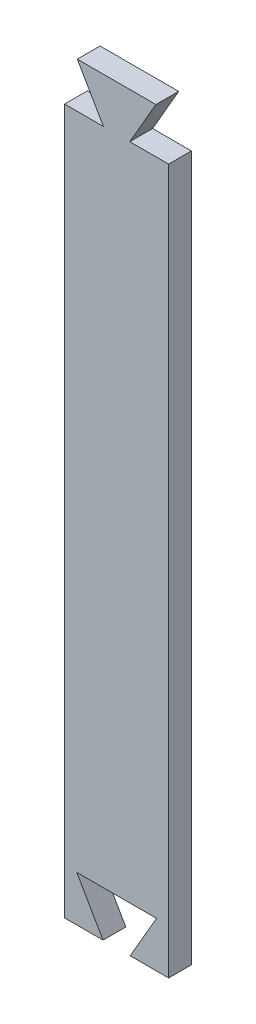
ISO-10303-21;
HEADER;
FILE_DESCRIPTION(('STEP AP214'),'2;1');
FILE_NAME('part.step','',(''),(''),'','','');
FILE_SCHEMA(('AUTOMOTIVE_DESIGN { 1 0 10303 214 1 1 1 1 }'));
ENDSEC;
DATA;
#1=APPLICATION_CONTEXT('core data for automotive mechanical design processes');
#2=APPLICATION_PROTOCOL_DEFINITION('international standard','automotive_design',2000,#1);
#3=PRODUCT_CONTEXT('',#1,'mechanical');
#4=PRODUCT('Part','Part','',(#3));
#5=PRODUCT_RELATED_PRODUCT_CATEGORY('part','',(#4));
#6=PRODUCT_DEFINITION_FORMATION('','',#4);
#7=PRODUCT_DEFINITION_CONTEXT('part definition',#1,'design');
#8=PRODUCT_DEFINITION('design','',#6,#7);
#9=PRODUCT_DEFINITION_SHAPE('','',#8);
#10=(LENGTH_UNIT() NAMED_UNIT(*) SI_UNIT(.MILLI.,.METRE.));
#11=(NAMED_UNIT(*) PLANE_ANGLE_UNIT() SI_UNIT($,.RADIAN.));
#12=(NAMED_UNIT(*) SI_UNIT($,.STERADIAN.) SOLID_ANGLE_UNIT());
#13=UNCERTAINTY_MEASURE_WITH_UNIT(LENGTH_MEASURE(1.E-05),#10,'distance_accuracy_value','');
#14=(GEOMETRIC_REPRESENTATION_CONTEXT(3) GLOBAL_UNCERTAINTY_ASSIGNED_CONTEXT((#13)) GLOBAL_UNIT_ASSIGNED_CONTEXT((#10,
#11,#12)) REPRESENTATION_CONTEXT('',''));
#15=CARTESIAN_POINT('',(0.,0.,0.));
#16=DIRECTION('',(0.,0.,1.));
#17=DIRECTION('',(1.,0.,0.));
#18=AXIS2_PLACEMENT_3D('',#15,#16,#17);
#19=CARTESIAN_POINT('',(-3.02412126503343,0.,5.08));
#20=DIRECTION('',(0.,1.,0.));
#21=DIRECTION('',(0.,0.,1.));
#22=AXIS2_PLACEMENT_3D('',#19,#20,#21);
#23=PLANE('',#22);
#24=DIRECTION('',(1.,0.,0.));
#25=VECTOR('',#24,1.);
#26=CARTESIAN_POINT('',(-3.02412126503343,0.,0.));
#27=LINE('',#26,#25);
#28=CARTESIAN_POINT('',(-11.5976146,0.,0.));
#29=VERTEX_POINT('',#28);
#30=CARTESIAN_POINT('',(-3.02412126503343,0.,0.));
#31=VERTEX_POINT('',#30);
#32=EDGE_CURVE('E164',#29,#31,#27,.T.);
#33=ORIENTED_EDGE('',*,*,#32,.T.);
#34=DIRECTION('',(0.,0.,-1.));
#35=VECTOR('',#34,1.);
#36=CARTESIAN_POINT('',(-3.02412126503343,0.,5.08));
#37=LINE('',#36,#35);
#38=CARTESIAN_POINT('',(-3.02412126503343,0.,5.08));
#39=VERTEX_POINT('',#38);
#40=EDGE_CURVE('E11',#39,#31,#37,.T.);
#41=ORIENTED_EDGE('',*,*,#40,.F.);
#42=DIRECTION('',(1.,0.,0.));
#43=VECTOR('',#42,1.);
#44=CARTESIAN_POINT('',(-3.02412126503343,0.,5.08));
#45=LINE('',#44,#43);
#46=CARTESIAN_POINT('',(-11.5976146,0.,5.08));
#47=VERTEX_POINT('',#46);
#48=EDGE_CURVE('E198',#47,#39,#45,.T.);
#49=ORIENTED_EDGE('',*,*,#48,.F.);
#50=DIRECTION('',(0.,0.,-1.));
#51=VECTOR('',#50,1.);
#52=CARTESIAN_POINT('',(-11.5976146,0.,5.08));
#53=LINE('',#52,#51);
#54=EDGE_CURVE('E160',#47,#29,#53,.T.);
#55=ORIENTED_EDGE('',*,*,#54,.T.);
#56=EDGE_LOOP('',(#33,#41,#49,#55));
#57=FACE_BOUND('',#56,.T.);
#58=ADVANCED_FACE('F39',(#57),#23,.F.);
#59=CARTESIAN_POINT('',(-3.02412126503343,0.,5.08));
#60=DIRECTION('',(-0.86602540378444,-0.499999999999998,0.));
#61=DIRECTION('',(0.499999999999998,-0.86602540378444,0.));
#62=AXIS2_PLACEMENT_3D('',#59,#60,#61);
#63=PLANE('',#62);
#64=DIRECTION('',(-0.499999999999998,0.86602540378444,0.));
#65=VECTOR('',#64,1.);
#66=CARTESIAN_POINT('',(-3.02412126503343,0.,0.));
#67=LINE('',#66,#65);
#68=CARTESIAN_POINT('',(-8.89,10.16,0.));
#69=VERTEX_POINT('',#68);
#70=EDGE_CURVE('E168',#31,#69,#67,.T.);
#71=ORIENTED_EDGE('',*,*,#70,.T.);
#72=DIRECTION('',(0.,0.,-1.));
#73=VECTOR('',#72,1.);
#74=CARTESIAN_POINT('',(-8.89,10.16,5.08));
#75=LINE('',#74,#73);
#76=CARTESIAN_POINT('',(-8.89,10.16,5.08));
#77=VERTEX_POINT('',#76);
#78=EDGE_CURVE('E48',#77,#69,#75,.T.);
#79=ORIENTED_EDGE('',*,*,#78,.F.);
#80=DIRECTION('',(-0.499999999999998,0.86602540378444,0.));
#81=VECTOR('',#80,1.);
#82=CARTESIAN_POINT('',(-3.02412126503343,0.,5.08));
#83=LINE('',#82,#81);
#84=EDGE_CURVE('E111',#39,#77,#83,.T.);
#85=ORIENTED_EDGE('',*,*,#84,.F.);
#86=ORIENTED_EDGE('',*,*,#40,.T.);
#87=EDGE_LOOP('',(#71,#79,#85,#86));
#88=FACE_BOUND('',#87,.T.);
#89=ADVANCED_FACE('F292',(#88),#63,.F.);
#90=CARTESIAN_POINT('',(-8.89,10.16,5.08));
#91=DIRECTION('',(0.,1.,0.));
#92=DIRECTION('',(0.,0.,1.));
#93=AXIS2_PLACEMENT_3D('',#90,#91,#92);
#94=PLANE('',#93);
#95=DIRECTION('',(1.,0.,0.));
#96=VECTOR('',#95,1.);
#97=CARTESIAN_POINT('',(-8.89,10.16,0.));
#98=LINE('',#97,#96);
#99=CARTESIAN_POINT('',(8.89,10.16,0.));
#100=VERTEX_POINT('',#99);
#101=EDGE_CURVE('E171',#69,#100,#98,.T.);
#102=ORIENTED_EDGE('',*,*,#101,.T.);
#103=DIRECTION('',(0.,0.,-1.));
#104=VECTOR('',#103,1.);
#105=CARTESIAN_POINT('',(8.89,10.16,5.08));
#106=LINE('',#105,#104);
#107=CARTESIAN_POINT('',(8.89,10.16,5.08));
#108=VERTEX_POINT('',#107);
#109=EDGE_CURVE('E225',#108,#100,#106,.T.);
#110=ORIENTED_EDGE('',*,*,#109,.F.);
#111=DIRECTION('',(1.,0.,0.));
#112=VECTOR('',#111,1.);
#113=CARTESIAN_POINT('',(-8.89,10.16,5.08));
#114=LINE('',#113,#112);
#115=EDGE_CURVE('E235',#77,#108,#114,.T.);
#116=ORIENTED_EDGE('',*,*,#115,.F.);
#117=ORIENTED_EDGE('',*,*,#78,.T.);
#118=EDGE_LOOP('',(#102,#110,#116,#117));
#119=FACE_BOUND('',#118,.T.);
#120=ADVANCED_FACE('F233',(#119),#94,.F.);
#121=CARTESIAN_POINT('',(8.89,10.16,5.08));
#122=DIRECTION('',(0.866025403784436,-0.500000000000004,0.));
#123=DIRECTION('',(0.500000000000004,0.866025403784436,0.));
#124=AXIS2_PLACEMENT_3D('',#121,#122,#123);
#125=PLANE('',#124);
#126=DIRECTION('',(-0.500000000000004,-0.866025403784436,0.));
#127=VECTOR('',#126,1.);
#128=CARTESIAN_POINT('',(8.89,10.16,0.));
#129=LINE('',#128,#127);
#130=CARTESIAN_POINT('',(3.02412126503334,0.,0.));
#131=VERTEX_POINT('',#130);
#132=EDGE_CURVE('E174',#100,#131,#129,.T.);
#133=ORIENTED_EDGE('',*,*,#132,.T.);
#134=DIRECTION('',(0.,0.,-1.));
#135=VECTOR('',#134,1.);
#136=CARTESIAN_POINT('',(3.02412126503334,0.,5.08));
#137=LINE('',#136,#135);
#138=CARTESIAN_POINT('',(3.02412126503334,0.,5.08));
#139=VERTEX_POINT('',#138);
#140=EDGE_CURVE('E221',#139,#131,#137,.T.);
#141=ORIENTED_EDGE('',*,*,#140,.F.);
#142=DIRECTION('',(-0.500000000000004,-0.866025403784436,0.));
#143=VECTOR('',#142,1.);
#144=CARTESIAN_POINT('',(8.89,10.16,5.08));
#145=LINE('',#144,#143);
#146=EDGE_CURVE('E254',#108,#139,#145,.T.);
#147=ORIENTED_EDGE('',*,*,#146,.F.);
#148=ORIENTED_EDGE('',*,*,#109,.T.);
#149=EDGE_LOOP('',(#133,#141,#147,#148));
#150=FACE_BOUND('',#149,.T.);
#151=ADVANCED_FACE('F244',(#150),#125,.F.);
#152=CARTESIAN_POINT('',(3.02412126503334,0.,5.08));
#153=DIRECTION('',(0.,1.,0.));
#154=DIRECTION('',(0.,0.,1.));
#155=AXIS2_PLACEMENT_3D('',#152,#153,#154);
#156=PLANE('',#155);
#157=DIRECTION('',(1.,0.,0.));
#158=VECTOR('',#157,1.);
#159=CARTESIAN_POINT('',(3.02412126503334,0.,0.));
#160=LINE('',#159,#158);
#161=CARTESIAN_POINT('',(11.5976146,0.,0.));
#162=VERTEX_POINT('',#161);
#163=EDGE_CURVE('E177',#131,#162,#160,.T.);
#164=ORIENTED_EDGE('',*,*,#163,.T.);
#165=DIRECTION('',(0.,0.,-1.));
#166=VECTOR('',#165,1.);
#167=CARTESIAN_POINT('',(11.5976146,0.,5.08));
#168=LINE('',#167,#166);
#169=CARTESIAN_POINT('',(11.5976146,0.,5.08));
#170=VERTEX_POINT('',#169);
#171=EDGE_CURVE('E217',#170,#162,#168,.T.);
#172=ORIENTED_EDGE('',*,*,#171,.F.);
#173=DIRECTION('',(1.,0.,0.));
#174=VECTOR('',#173,1.);
#175=CARTESIAN_POINT('',(3.02412126503334,0.,5.08));
#176=LINE('',#175,#174);
#177=EDGE_CURVE('E250',#139,#170,#176,.T.);
#178=ORIENTED_EDGE('',*,*,#177,.F.);
#179=ORIENTED_EDGE('',*,*,#140,.T.);
#180=EDGE_LOOP('',(#164,#172,#178,#179));
#181=FACE_BOUND('',#180,.T.);
#182=ADVANCED_FACE('F248',(#181),#156,.F.);
#183=CARTESIAN_POINT('',(11.5976146,0.,5.08));
#184=DIRECTION('',(-1.,0.,0.));
#185=DIRECTION('',(0.,-1.,0.));
#186=AXIS2_PLACEMENT_3D('',#183,#184,#185);
#187=PLANE('',#186);
#188=DIRECTION('',(0.,1.,0.));
#189=VECTOR('',#188,1.);
#190=CARTESIAN_POINT('',(11.5976146,0.,0.));
#191=LINE('',#190,#189);
#192=CARTESIAN_POINT('',(11.5976146,157.1625,0.));
#193=VERTEX_POINT('',#192);
#194=EDGE_CURVE('E180',#162,#193,#191,.T.);
#195=ORIENTED_EDGE('',*,*,#194,.T.);
#196=DIRECTION('',(0.,0.,-1.));
#197=VECTOR('',#196,1.);
#198=CARTESIAN_POINT('',(11.5976146,157.1625,5.08));
#199=LINE('',#198,#197);
#200=CARTESIAN_POINT('',(11.5976146,157.1625,5.08));
#201=VERTEX_POINT('',#200);
#202=EDGE_CURVE('E213',#201,#193,#199,.T.);
#203=ORIENTED_EDGE('',*,*,#202,.F.);
#204=DIRECTION('',(0.,1.,0.));
#205=VECTOR('',#204,1.);
#206=CARTESIAN_POINT('',(11.5976146,0.,5.08));
#207=LINE('',#206,#205);
#208=EDGE_CURVE('E253',#170,#201,#207,.T.);
#209=ORIENTED_EDGE('',*,*,#208,.F.);
#210=ORIENTED_EDGE('',*,*,#171,.T.);
#211=EDGE_LOOP('',(#195,#203,#209,#210));
#212=FACE_BOUND('',#211,.T.);
#213=ADVANCED_FACE('F305',(#212),#187,.F.);
#214=CARTESIAN_POINT('',(11.5976146,157.1625,5.08));
#215=DIRECTION('',(0.,-1.,0.));
#216=DIRECTION('',(0.,0.,-1.));
#217=AXIS2_PLACEMENT_3D('',#214,#215,#216);
#218=PLANE('',#217);
#219=DIRECTION('',(-1.,0.,0.));
#220=VECTOR('',#219,1.);
#221=CARTESIAN_POINT('',(11.5976146,157.1625,0.));
#222=LINE('',#221,#220);
#223=CARTESIAN_POINT('',(2.94111535554568,157.1625,0.));
#224=VERTEX_POINT('',#223);
#225=EDGE_CURVE('E183',#193,#224,#222,.T.);
#226=ORIENTED_EDGE('',*,*,#225,.T.);
#227=DIRECTION('',(0.,0.,-1.));
#228=VECTOR('',#227,1.);
#229=CARTESIAN_POINT('',(2.94111535554568,157.1625,5.08));
#230=LINE('',#229,#228);
#231=CARTESIAN_POINT('',(2.94111535554568,157.1625,5.08));
#232=VERTEX_POINT('',#231);
#233=EDGE_CURVE('E209',#232,#224,#230,.T.);
#234=ORIENTED_EDGE('',*,*,#233,.F.);
#235=DIRECTION('',(-1.,0.,0.));
#236=VECTOR('',#235,1.);
#237=CARTESIAN_POINT('',(11.5976146,157.1625,5.08));
#238=LINE('',#237,#236);
#239=EDGE_CURVE('E258',#201,#232,#238,.T.);
#240=ORIENTED_EDGE('',*,*,#239,.F.);
#241=ORIENTED_EDGE('',*,*,#202,.T.);
#242=EDGE_LOOP('',(#226,#234,#240,#241));
#243=FACE_BOUND('',#242,.T.);
#244=ADVANCED_FACE('F308',(#243),#218,.F.);
#245=CARTESIAN_POINT('',(8.763,167.2463,5.08));
#246=DIRECTION('',(-0.86602540378444,0.499999999999998,0.));
#247=DIRECTION('',(-0.499999999999998,-0.86602540378444,0.));
#248=AXIS2_PLACEMENT_3D('',#245,#246,#247);
#249=PLANE('',#248);
#250=DIRECTION('',(0.499999999999998,0.86602540378444,0.));
#251=VECTOR('',#250,1.);
#252=CARTESIAN_POINT('',(8.763,167.2463,0.));
#253=LINE('',#252,#251);
#254=CARTESIAN_POINT('',(8.763,167.2463,0.));
#255=VERTEX_POINT('',#254);
#256=EDGE_CURVE('E186',#224,#255,#253,.T.);
#257=ORIENTED_EDGE('',*,*,#256,.T.);
#258=DIRECTION('',(0.,0.,-1.));
#259=VECTOR('',#258,1.);
#260=CARTESIAN_POINT('',(8.763,167.2463,5.08));
#261=LINE('',#260,#259);
#262=CARTESIAN_POINT('',(8.763,167.2463,5.08));
#263=VERTEX_POINT('',#262);
#264=EDGE_CURVE('E205',#263,#255,#261,.T.);
#265=ORIENTED_EDGE('',*,*,#264,.F.);
#266=DIRECTION('',(0.499999999999998,0.86602540378444,0.));
#267=VECTOR('',#266,1.);
#268=CARTESIAN_POINT('',(8.763,167.2463,5.08));
#269=LINE('',#268,#267);
#270=EDGE_CURVE('E265',#232,#263,#269,.T.);
#271=ORIENTED_EDGE('',*,*,#270,.F.);
#272=ORIENTED_EDGE('',*,*,#233,.T.);
#273=EDGE_LOOP('',(#257,#265,#271,#272));
#274=FACE_BOUND('',#273,.T.);
#275=ADVANCED_FACE('F273',(#274),#249,.F.);
#276=CARTESIAN_POINT('',(-8.763,167.2463,5.08));
#277=DIRECTION('',(0.,-1.,0.));
#278=DIRECTION('',(0.,0.,-1.));
#279=AXIS2_PLACEMENT_3D('',#276,#277,#278);
#280=PLANE('',#279);
#281=DIRECTION('',(-1.,0.,0.));
#282=VECTOR('',#281,1.);
#283=CARTESIAN_POINT('',(-8.763,167.2463,0.));
#284=LINE('',#283,#282);
#285=CARTESIAN_POINT('',(-8.763,167.2463,0.));
#286=VERTEX_POINT('',#285);
#287=EDGE_CURVE('E189',#255,#286,#284,.T.);
#288=ORIENTED_EDGE('',*,*,#287,.T.);
#289=DIRECTION('',(0.,0.,-1.));
#290=VECTOR('',#289,1.);
#291=CARTESIAN_POINT('',(-8.763,167.2463,5.08));
#292=LINE('',#291,#290);
#293=CARTESIAN_POINT('',(-8.763,167.2463,5.08));
#294=VERTEX_POINT('',#293);
#295=EDGE_CURVE('E153',#294,#286,#292,.T.);
#296=ORIENTED_EDGE('',*,*,#295,.F.);
#297=DIRECTION('',(-1.,0.,0.));
#298=VECTOR('',#297,1.);
#299=CARTESIAN_POINT('',(-8.763,167.2463,5.08));
#300=LINE('',#299,#298);
#301=EDGE_CURVE('E142',#263,#294,#300,.T.);
#302=ORIENTED_EDGE('',*,*,#301,.F.);
#303=ORIENTED_EDGE('',*,*,#264,.T.);
#304=EDGE_LOOP('',(#288,#296,#302,#303));
#305=FACE_BOUND('',#304,.T.);
#306=ADVANCED_FACE('F277',(#305),#280,.F.);
#307=CARTESIAN_POINT('',(-2.94111535554568,157.1625,5.08));
#308=DIRECTION('',(0.86602540378444,0.499999999999998,0.));
#309=DIRECTION('',(-0.499999999999998,0.86602540378444,0.));
#310=AXIS2_PLACEMENT_3D('',#307,#308,#309);
#311=PLANE('',#310);
#312=DIRECTION('',(0.499999999999998,-0.86602540378444,0.));
#313=VECTOR('',#312,1.);
#314=CARTESIAN_POINT('',(-2.94111535554568,157.1625,0.));
#315=LINE('',#314,#313);
#316=CARTESIAN_POINT('',(-2.94111535554568,157.1625,0.));
#317=VERTEX_POINT('',#316);
#318=EDGE_CURVE('E151',#286,#317,#315,.T.);
#319=ORIENTED_EDGE('',*,*,#318,.T.);
#320=DIRECTION('',(0.,0.,-1.));
#321=VECTOR('',#320,1.);
#322=CARTESIAN_POINT('',(-2.94111535554568,157.1625,5.08));
#323=LINE('',#322,#321);
#324=CARTESIAN_POINT('',(-2.94111535554568,157.1625,5.08));
#325=VERTEX_POINT('',#324);
#326=EDGE_CURVE('E148',#325,#317,#323,.T.);
#327=ORIENTED_EDGE('',*,*,#326,.F.);
#328=DIRECTION('',(0.499999999999998,-0.86602540378444,0.));
#329=VECTOR('',#328,1.);
#330=CARTESIAN_POINT('',(-2.94111535554568,157.1625,5.08));
#331=LINE('',#330,#329);
#332=EDGE_CURVE('E136',#294,#325,#331,.T.);
#333=ORIENTED_EDGE('',*,*,#332,.F.);
#334=ORIENTED_EDGE('',*,*,#295,.T.);
#335=EDGE_LOOP('',(#319,#327,#333,#334));
#336=FACE_BOUND('',#335,.T.);
#337=ADVANCED_FACE('F149',(#336),#311,.F.);
#338=CARTESIAN_POINT('',(-2.94111535554568,157.1625,5.08));
#339=DIRECTION('',(0.,-1.,0.));
#340=DIRECTION('',(0.,0.,-1.));
#341=AXIS2_PLACEMENT_3D('',#338,#339,#340);
#342=PLANE('',#341);
#343=DIRECTION('',(-1.,0.,0.));
#344=VECTOR('',#343,1.);
#345=CARTESIAN_POINT('',(-2.94111535554568,157.1625,0.));
#346=LINE('',#345,#344);
#347=CARTESIAN_POINT('',(-11.5976146,157.1625,0.));
#348=VERTEX_POINT('',#347);
#349=EDGE_CURVE('E97',#317,#348,#346,.T.);
#350=ORIENTED_EDGE('',*,*,#349,.T.);
#351=DIRECTION('',(0.,0.,-1.));
#352=VECTOR('',#351,1.);
#353=CARTESIAN_POINT('',(-11.5976146,157.1625,5.08));
#354=LINE('',#353,#352);
#355=CARTESIAN_POINT('',(-11.5976146,157.1625,5.08));
#356=VERTEX_POINT('',#355);
#357=EDGE_CURVE('E154',#356,#348,#354,.T.);
#358=ORIENTED_EDGE('',*,*,#357,.F.);
#359=DIRECTION('',(-1.,0.,0.));
#360=VECTOR('',#359,1.);
#361=CARTESIAN_POINT('',(-2.94111535554568,157.1625,5.08));
#362=LINE('',#361,#360);
#363=EDGE_CURVE('E140',#325,#356,#362,.T.);
#364=ORIENTED_EDGE('',*,*,#363,.F.);
#365=ORIENTED_EDGE('',*,*,#326,.T.);
#366=EDGE_LOOP('',(#350,#358,#364,#365));
#367=FACE_BOUND('',#366,.T.);
#368=ADVANCED_FACE('F156',(#367),#342,.F.);
#369=CARTESIAN_POINT('',(-11.5976146,0.,5.08));
#370=DIRECTION('',(1.,0.,0.));
#371=DIRECTION('',(0.,1.,0.));
#372=AXIS2_PLACEMENT_3D('',#369,#370,#371);
#373=PLANE('',#372);
#374=DIRECTION('',(0.,-1.,0.));
#375=VECTOR('',#374,1.);
#376=CARTESIAN_POINT('',(-11.5976146,0.,0.));
#377=LINE('',#376,#375);
#378=EDGE_CURVE('E103',#348,#29,#377,.T.);
#379=ORIENTED_EDGE('',*,*,#378,.T.);
#380=ORIENTED_EDGE('',*,*,#54,.F.);
#381=DIRECTION('',(0.,-1.,0.));
#382=VECTOR('',#381,1.);
#383=CARTESIAN_POINT('',(-11.5976146,0.,5.08));
#384=LINE('',#383,#382);
#385=EDGE_CURVE('E56',#356,#47,#384,.T.);
#386=ORIENTED_EDGE('',*,*,#385,.F.);
#387=ORIENTED_EDGE('',*,*,#357,.T.);
#388=EDGE_LOOP('',(#379,#380,#386,#387));
#389=FACE_BOUND('',#388,.T.);
#390=ADVANCED_FACE('F281',(#389),#373,.F.);
#391=CARTESIAN_POINT('',(0.,0.,5.08));
#392=DIRECTION('',(0.,0.,-1.));
#393=DIRECTION('',(-1.,0.,0.));
#394=AXIS2_PLACEMENT_3D('',#391,#392,#393);
#395=PLANE('',#394);
#396=ORIENTED_EDGE('',*,*,#48,.T.);
#397=ORIENTED_EDGE('',*,*,#84,.T.);
#398=ORIENTED_EDGE('',*,*,#115,.T.);
#399=ORIENTED_EDGE('',*,*,#146,.T.);
#400=ORIENTED_EDGE('',*,*,#177,.T.);
#401=ORIENTED_EDGE('',*,*,#208,.T.);
#402=ORIENTED_EDGE('',*,*,#239,.T.);
#403=ORIENTED_EDGE('',*,*,#270,.T.);
#404=ORIENTED_EDGE('',*,*,#301,.T.);
#405=ORIENTED_EDGE('',*,*,#332,.T.);
#406=ORIENTED_EDGE('',*,*,#363,.T.);
#407=ORIENTED_EDGE('',*,*,#385,.T.);
#408=EDGE_LOOP('',(#396,#397,#398,#399,#400,#401,#402,#403,#404,#405,#406,#407));
#409=FACE_BOUND('',#408,.T.);
#410=ADVANCED_FACE('F138',(#409),#395,.F.);
#411=CARTESIAN_POINT('',(0.,0.,0.));
#412=DIRECTION('',(0.,0.,-1.));
#413=DIRECTION('',(-1.,0.,0.));
#414=AXIS2_PLACEMENT_3D('',#411,#412,#413);
#415=PLANE('',#414);
#416=ORIENTED_EDGE('',*,*,#32,.F.);
#417=ORIENTED_EDGE('',*,*,#378,.F.);
#418=ORIENTED_EDGE('',*,*,#349,.F.);
#419=ORIENTED_EDGE('',*,*,#318,.F.);
#420=ORIENTED_EDGE('',*,*,#287,.F.);
#421=ORIENTED_EDGE('',*,*,#256,.F.);
#422=ORIENTED_EDGE('',*,*,#225,.F.);
#423=ORIENTED_EDGE('',*,*,#194,.F.);
#424=ORIENTED_EDGE('',*,*,#163,.F.);
#425=ORIENTED_EDGE('',*,*,#132,.F.);
#426=ORIENTED_EDGE('',*,*,#101,.F.);
#427=ORIENTED_EDGE('',*,*,#70,.F.);
#428=EDGE_LOOP('',(#416,#417,#418,#419,#420,#421,#422,#423,#424,#425,#426,#427));
#429=FACE_BOUND('',#428,.T.);
#430=ADVANCED_FACE('F239',(#429),#415,.T.);
#431=CLOSED_SHELL('',(#58,#89,#120,#151,#182,#213,#244,#275,#306,#337,#368,#390,#410,#430));
#432=MANIFOLD_SOLID_BREP('B2',#431);
#433=ADVANCED_BREP_SHAPE_REPRESENTATION('',(#18,#432),#14);
#434=SHAPE_DEFINITION_REPRESENTATION(#9,#433);
ENDSEC;
END-ISO-10303-21;
